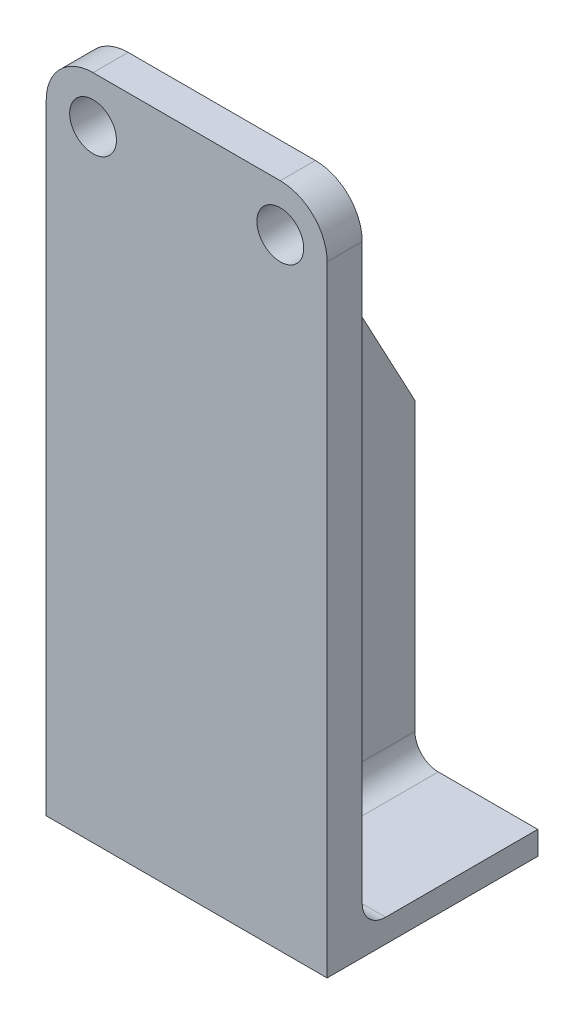
ISO-10303-21;
HEADER;
FILE_DESCRIPTION(('STEP AP214'),'2;1');
FILE_NAME('part.step','',(''),(''),'','','');
FILE_SCHEMA(('AUTOMOTIVE_DESIGN { 1 0 10303 214 1 1 1 1 }'));
ENDSEC;
DATA;
#1=APPLICATION_CONTEXT('core data for automotive mechanical design processes');
#2=APPLICATION_PROTOCOL_DEFINITION('international standard','automotive_design',2000,#1);
#3=PRODUCT_CONTEXT('',#1,'mechanical');
#4=PRODUCT('Part','Part','',(#3));
#5=PRODUCT_RELATED_PRODUCT_CATEGORY('part','',(#4));
#6=PRODUCT_DEFINITION_FORMATION('','',#4);
#7=PRODUCT_DEFINITION_CONTEXT('part definition',#1,'design');
#8=PRODUCT_DEFINITION('design','',#6,#7);
#9=PRODUCT_DEFINITION_SHAPE('','',#8);
#10=(LENGTH_UNIT() NAMED_UNIT(*) SI_UNIT(.MILLI.,.METRE.));
#11=(NAMED_UNIT(*) PLANE_ANGLE_UNIT() SI_UNIT($,.RADIAN.));
#12=(NAMED_UNIT(*) SI_UNIT($,.STERADIAN.) SOLID_ANGLE_UNIT());
#13=UNCERTAINTY_MEASURE_WITH_UNIT(LENGTH_MEASURE(1.E-05),#10,'distance_accuracy_value','');
#14=(GEOMETRIC_REPRESENTATION_CONTEXT(3) GLOBAL_UNCERTAINTY_ASSIGNED_CONTEXT((#13)) GLOBAL_UNIT_ASSIGNED_CONTEXT((#10,
#11,#12)) REPRESENTATION_CONTEXT('',''));
#15=CARTESIAN_POINT('',(0.,0.,0.));
#16=DIRECTION('',(0.,0.,1.));
#17=DIRECTION('',(1.,0.,0.));
#18=AXIS2_PLACEMENT_3D('',#15,#16,#17);
#19=CARTESIAN_POINT('',(-8.00000000000001,26.,0.));
#20=DIRECTION('',(0.,0.,-1.));
#21=DIRECTION('',(-1.,0.,0.));
#22=AXIS2_PLACEMENT_3D('',#19,#20,#21);
#23=PLANE('',#22);
#24=CARTESIAN_POINT('',(8.00000000000001,26.,0.));
#25=DIRECTION('',(0.,0.,1.));
#26=DIRECTION('',(1.,0.,0.));
#27=AXIS2_PLACEMENT_3D('',#24,#25,#26);
#28=CIRCLE('',#27,2.);
#29=CARTESIAN_POINT('',(10.,26.,0.));
#30=VERTEX_POINT('',#29);
#31=EDGE_CURVE('E213',#30,#30,#28,.T.);
#32=ORIENTED_EDGE('',*,*,#31,.T.);
#33=EDGE_LOOP('',(#32));
#34=FACE_BOUND('',#33,.T.);
#35=CARTESIAN_POINT('',(-8.00000000000001,26.,0.));
#36=DIRECTION('',(0.,0.,1.));
#37=DIRECTION('',(-1.,0.,0.));
#38=AXIS2_PLACEMENT_3D('',#35,#36,#37);
#39=CIRCLE('',#38,2.);
#40=CARTESIAN_POINT('',(-10.,26.,0.));
#41=VERTEX_POINT('',#40);
#42=EDGE_CURVE('E208',#41,#41,#39,.T.);
#43=ORIENTED_EDGE('',*,*,#42,.T.);
#44=EDGE_LOOP('',(#43));
#45=FACE_BOUND('',#44,.T.);
#46=DIRECTION('',(0.,1.,0.));
#47=VECTOR('',#46,1.);
#48=CARTESIAN_POINT('',(12.,26.,0.));
#49=LINE('',#48,#47);
#50=CARTESIAN_POINT('',(12.,-23.,0.));
#51=VERTEX_POINT('',#50);
#52=CARTESIAN_POINT('',(12.,26.,0.));
#53=VERTEX_POINT('',#52);
#54=EDGE_CURVE('E249',#51,#53,#49,.T.);
#55=ORIENTED_EDGE('',*,*,#54,.F.);
#56=DIRECTION('',(1.,0.,0.));
#57=VECTOR('',#56,1.);
#58=CARTESIAN_POINT('',(-8.00000000000001,-23.,0.));
#59=LINE('',#58,#57);
#60=CARTESIAN_POINT('',(1.5,-23.,0.));
#61=VERTEX_POINT('',#60);
#62=EDGE_CURVE('E291',#51,#61,#59,.F.);
#63=ORIENTED_EDGE('',*,*,#62,.T.);
#64=DIRECTION('',(0.,-1.,0.));
#65=VECTOR('',#64,1.);
#66=CARTESIAN_POINT('',(1.5,1.5,0.));
#67=LINE('',#66,#65);
#68=CARTESIAN_POINT('',(1.5,29.5,0.));
#69=VERTEX_POINT('',#68);
#70=EDGE_CURVE('E194',#69,#61,#67,.T.);
#71=ORIENTED_EDGE('',*,*,#70,.F.);
#72=DIRECTION('',(-1.,0.,0.));
#73=VECTOR('',#72,1.);
#74=CARTESIAN_POINT('',(1.5,29.5,0.));
#75=LINE('',#74,#73);
#76=CARTESIAN_POINT('',(-1.5,29.5,0.));
#77=VERTEX_POINT('',#76);
#78=EDGE_CURVE('E197',#69,#77,#75,.T.);
#79=ORIENTED_EDGE('',*,*,#78,.T.);
#80=DIRECTION('',(0.,-1.,0.));
#81=VECTOR('',#80,1.);
#82=CARTESIAN_POINT('',(-1.5,1.5,0.));
#83=LINE('',#82,#81);
#84=CARTESIAN_POINT('',(-1.5,-23.,0.));
#85=VERTEX_POINT('',#84);
#86=EDGE_CURVE('E185',#77,#85,#83,.T.);
#87=ORIENTED_EDGE('',*,*,#86,.T.);
#88=DIRECTION('',(1.,0.,0.));
#89=VECTOR('',#88,1.);
#90=CARTESIAN_POINT('',(-8.00000000000001,-23.,0.));
#91=LINE('',#90,#89);
#92=CARTESIAN_POINT('',(-12.,-23.,0.));
#93=VERTEX_POINT('',#92);
#94=EDGE_CURVE('E288',#85,#93,#91,.F.);
#95=ORIENTED_EDGE('',*,*,#94,.T.);
#96=DIRECTION('',(0.,-1.,0.));
#97=VECTOR('',#96,1.);
#98=CARTESIAN_POINT('',(-12.,26.,0.));
#99=LINE('',#98,#97);
#100=CARTESIAN_POINT('',(-12.,26.,0.));
#101=VERTEX_POINT('',#100);
#102=EDGE_CURVE('E245',#101,#93,#99,.T.);
#103=ORIENTED_EDGE('',*,*,#102,.F.);
#104=CARTESIAN_POINT('',(-8.00000000000001,26.,0.));
#105=DIRECTION('',(0.,0.,1.));
#106=DIRECTION('',(-1.,0.,0.));
#107=AXIS2_PLACEMENT_3D('',#104,#105,#106);
#108=CIRCLE('',#107,4.);
#109=CARTESIAN_POINT('',(-8.00000000000001,30.,0.));
#110=VERTEX_POINT('',#109);
#111=EDGE_CURVE('E221',#110,#101,#108,.T.);
#112=ORIENTED_EDGE('',*,*,#111,.F.);
#113=DIRECTION('',(-1.,0.,0.));
#114=VECTOR('',#113,1.);
#115=CARTESIAN_POINT('',(-8.00000000000001,30.,0.));
#116=LINE('',#115,#114);
#117=CARTESIAN_POINT('',(8.00000000000001,30.,0.));
#118=VERTEX_POINT('',#117);
#119=EDGE_CURVE('E230',#118,#110,#116,.T.);
#120=ORIENTED_EDGE('',*,*,#119,.F.);
#121=CARTESIAN_POINT('',(8.00000000000001,26.,0.));
#122=DIRECTION('',(0.,0.,1.));
#123=DIRECTION('',(1.,0.,0.));
#124=AXIS2_PLACEMENT_3D('',#121,#122,#123);
#125=CIRCLE('',#124,4.);
#126=EDGE_CURVE('E252',#53,#118,#125,.T.);
#127=ORIENTED_EDGE('',*,*,#126,.F.);
#128=EDGE_LOOP('',(#55,#63,#71,#79,#87,#95,#103,#112,#120,#127));
#129=FACE_BOUND('',#128,.T.);
#130=ADVANCED_FACE('F39',(#34,#45,#129),#23,.T.);
#131=CARTESIAN_POINT('',(-8.00000000000001,26.,3.));
#132=DIRECTION('',(0.,0.,-1.));
#133=DIRECTION('',(-1.,0.,0.));
#134=AXIS2_PLACEMENT_3D('',#131,#132,#133);
#135=PLANE('',#134);
#136=CARTESIAN_POINT('',(-8.00000000000001,26.,3.));
#137=DIRECTION('',(0.,0.,1.));
#138=DIRECTION('',(-1.,0.,0.));
#139=AXIS2_PLACEMENT_3D('',#136,#137,#138);
#140=CIRCLE('',#139,4.);
#141=CARTESIAN_POINT('',(-8.00000000000001,30.,3.));
#142=VERTEX_POINT('',#141);
#143=CARTESIAN_POINT('',(-12.,26.,3.));
#144=VERTEX_POINT('',#143);
#145=EDGE_CURVE('E225',#142,#144,#140,.T.);
#146=ORIENTED_EDGE('',*,*,#145,.T.);
#147=DIRECTION('',(0.,-1.,0.));
#148=VECTOR('',#147,1.);
#149=CARTESIAN_POINT('',(-12.,26.,3.));
#150=LINE('',#149,#148);
#151=CARTESIAN_POINT('',(-12.,-27.,3.));
#152=VERTEX_POINT('',#151);
#153=EDGE_CURVE('E229',#144,#152,#150,.T.);
#154=ORIENTED_EDGE('',*,*,#153,.T.);
#155=DIRECTION('',(-1.,0.,0.));
#156=VECTOR('',#155,1.);
#157=CARTESIAN_POINT('',(0.,-27.,3.));
#158=LINE('',#157,#156);
#159=CARTESIAN_POINT('',(12.,-27.,3.));
#160=VERTEX_POINT('',#159);
#161=EDGE_CURVE('E161',#160,#152,#158,.T.);
#162=ORIENTED_EDGE('',*,*,#161,.F.);
#163=DIRECTION('',(0.,1.,0.));
#164=VECTOR('',#163,1.);
#165=CARTESIAN_POINT('',(12.,26.,3.));
#166=LINE('',#165,#164);
#167=CARTESIAN_POINT('',(12.,26.,3.));
#168=VERTEX_POINT('',#167);
#169=EDGE_CURVE('E156',#160,#168,#166,.T.);
#170=ORIENTED_EDGE('',*,*,#169,.T.);
#171=CARTESIAN_POINT('',(8.00000000000001,26.,3.));
#172=DIRECTION('',(0.,0.,1.));
#173=DIRECTION('',(1.,0.,0.));
#174=AXIS2_PLACEMENT_3D('',#171,#172,#173);
#175=CIRCLE('',#174,4.);
#176=CARTESIAN_POINT('',(8.00000000000001,30.,3.));
#177=VERTEX_POINT('',#176);
#178=EDGE_CURVE('E235',#168,#177,#175,.T.);
#179=ORIENTED_EDGE('',*,*,#178,.T.);
#180=DIRECTION('',(-1.,0.,0.));
#181=VECTOR('',#180,1.);
#182=CARTESIAN_POINT('',(-8.00000000000001,30.,3.));
#183=LINE('',#182,#181);
#184=EDGE_CURVE('E238',#177,#142,#183,.T.);
#185=ORIENTED_EDGE('',*,*,#184,.T.);
#186=EDGE_LOOP('',(#146,#154,#162,#170,#179,#185));
#187=FACE_BOUND('',#186,.T.);
#188=CARTESIAN_POINT('',(8.00000000000001,26.,3.));
#189=DIRECTION('',(0.,0.,1.));
#190=DIRECTION('',(1.,0.,0.));
#191=AXIS2_PLACEMENT_3D('',#188,#189,#190);
#192=CIRCLE('',#191,2.);
#193=CARTESIAN_POINT('',(10.,26.,3.));
#194=VERTEX_POINT('',#193);
#195=EDGE_CURVE('E217',#194,#194,#192,.T.);
#196=ORIENTED_EDGE('',*,*,#195,.F.);
#197=EDGE_LOOP('',(#196));
#198=FACE_BOUND('',#197,.T.);
#199=CARTESIAN_POINT('',(-8.00000000000001,26.,3.));
#200=DIRECTION('',(0.,0.,1.));
#201=DIRECTION('',(-1.,0.,0.));
#202=AXIS2_PLACEMENT_3D('',#199,#200,#201);
#203=CIRCLE('',#202,2.);
#204=CARTESIAN_POINT('',(-10.,26.,3.));
#205=VERTEX_POINT('',#204);
#206=EDGE_CURVE('E209',#205,#205,#203,.T.);
#207=ORIENTED_EDGE('',*,*,#206,.F.);
#208=EDGE_LOOP('',(#207));
#209=FACE_BOUND('',#208,.T.);
#210=ADVANCED_FACE('F377',(#187,#198,#209),#135,.F.);
#211=CARTESIAN_POINT('',(-8.00000000000001,26.,3.));
#212=DIRECTION('',(0.,0.,-1.));
#213=DIRECTION('',(-1.,0.,0.));
#214=AXIS2_PLACEMENT_3D('',#211,#212,#213);
#215=CYLINDRICAL_SURFACE('',#214,4.);
#216=ORIENTED_EDGE('',*,*,#111,.T.);
#217=DIRECTION('',(0.,0.,-1.));
#218=VECTOR('',#217,1.);
#219=CARTESIAN_POINT('',(-12.,26.,3.));
#220=LINE('',#219,#218);
#221=EDGE_CURVE('E268',#144,#101,#220,.T.);
#222=ORIENTED_EDGE('',*,*,#221,.F.);
#223=ORIENTED_EDGE('',*,*,#145,.F.);
#224=DIRECTION('',(0.,0.,-1.));
#225=VECTOR('',#224,1.);
#226=CARTESIAN_POINT('',(-8.00000000000001,30.,3.));
#227=LINE('',#226,#225);
#228=EDGE_CURVE('E241',#142,#110,#227,.T.);
#229=ORIENTED_EDGE('',*,*,#228,.T.);
#230=EDGE_LOOP('',(#216,#222,#223,#229));
#231=FACE_BOUND('',#230,.T.);
#232=ADVANCED_FACE('F337',(#231),#215,.T.);
#233=CARTESIAN_POINT('',(-12.,26.,3.));
#234=DIRECTION('',(1.,0.,0.));
#235=DIRECTION('',(0.,1.,0.));
#236=AXIS2_PLACEMENT_3D('',#233,#234,#235);
#237=PLANE('',#236);
#238=ORIENTED_EDGE('',*,*,#102,.T.);
#239=CARTESIAN_POINT('',(-12.,-23.,-2.));
#240=DIRECTION('',(1.,0.,0.));
#241=DIRECTION('',(0.,1.,0.));
#242=AXIS2_PLACEMENT_3D('',#239,#240,#241);
#243=CIRCLE('',#242,2.);
#244=CARTESIAN_POINT('',(-12.,-25.,-2.));
#245=VERTEX_POINT('',#244);
#246=EDGE_CURVE('E11',#93,#245,#243,.T.);
#247=ORIENTED_EDGE('',*,*,#246,.T.);
#248=DIRECTION('',(0.,0.,-1.));
#249=VECTOR('',#248,1.);
#250=CARTESIAN_POINT('',(-12.,-25.,0.));
#251=LINE('',#250,#249);
#252=CARTESIAN_POINT('',(-12.,-25.,-15.));
#253=VERTEX_POINT('',#252);
#254=EDGE_CURVE('E171',#245,#253,#251,.T.);
#255=ORIENTED_EDGE('',*,*,#254,.T.);
#256=DIRECTION('',(0.,1.,0.));
#257=VECTOR('',#256,1.);
#258=CARTESIAN_POINT('',(-12.,-27.,-15.));
#259=LINE('',#258,#257);
#260=CARTESIAN_POINT('',(-12.,-27.,-15.));
#261=VERTEX_POINT('',#260);
#262=EDGE_CURVE('E180',#261,#253,#259,.T.);
#263=ORIENTED_EDGE('',*,*,#262,.F.);
#264=DIRECTION('',(0.,0.,-1.));
#265=VECTOR('',#264,1.);
#266=CARTESIAN_POINT('',(-12.,-27.,0.));
#267=LINE('',#266,#265);
#268=EDGE_CURVE('E167',#152,#261,#267,.T.);
#269=ORIENTED_EDGE('',*,*,#268,.F.);
#270=ORIENTED_EDGE('',*,*,#153,.F.);
#271=ORIENTED_EDGE('',*,*,#221,.T.);
#272=EDGE_LOOP('',(#238,#247,#255,#263,#269,#270,#271));
#273=FACE_BOUND('',#272,.T.);
#274=ADVANCED_FACE('F333',(#273),#237,.F.);
#275=CARTESIAN_POINT('',(12.,26.,3.));
#276=DIRECTION('',(-1.,0.,0.));
#277=DIRECTION('',(0.,-1.,0.));
#278=AXIS2_PLACEMENT_3D('',#275,#276,#277);
#279=PLANE('',#278);
#280=ORIENTED_EDGE('',*,*,#169,.F.);
#281=DIRECTION('',(0.,0.,1.));
#282=VECTOR('',#281,1.);
#283=CARTESIAN_POINT('',(12.,-27.,0.));
#284=LINE('',#283,#282);
#285=CARTESIAN_POINT('',(12.,-27.,-15.));
#286=VERTEX_POINT('',#285);
#287=EDGE_CURVE('E149',#286,#160,#284,.T.);
#288=ORIENTED_EDGE('',*,*,#287,.F.);
#289=DIRECTION('',(0.,1.,0.));
#290=VECTOR('',#289,1.);
#291=CARTESIAN_POINT('',(12.,-27.,-15.));
#292=LINE('',#291,#290);
#293=CARTESIAN_POINT('',(12.,-25.,-15.));
#294=VERTEX_POINT('',#293);
#295=EDGE_CURVE('E154',#286,#294,#292,.T.);
#296=ORIENTED_EDGE('',*,*,#295,.T.);
#297=DIRECTION('',(0.,0.,1.));
#298=VECTOR('',#297,1.);
#299=CARTESIAN_POINT('',(12.,-25.,0.));
#300=LINE('',#299,#298);
#301=CARTESIAN_POINT('',(12.,-25.,-2.));
#302=VERTEX_POINT('',#301);
#303=EDGE_CURVE('E642',#294,#302,#300,.T.);
#304=ORIENTED_EDGE('',*,*,#303,.T.);
#305=CARTESIAN_POINT('',(12.,-23.,-2.));
#306=DIRECTION('',(-1.,0.,0.));
#307=DIRECTION('',(0.,-1.,0.));
#308=AXIS2_PLACEMENT_3D('',#305,#306,#307);
#309=CIRCLE('',#308,2.);
#310=EDGE_CURVE('E305',#302,#51,#309,.T.);
#311=ORIENTED_EDGE('',*,*,#310,.T.);
#312=ORIENTED_EDGE('',*,*,#54,.T.);
#313=DIRECTION('',(0.,0.,-1.));
#314=VECTOR('',#313,1.);
#315=CARTESIAN_POINT('',(12.,26.,3.));
#316=LINE('',#315,#314);
#317=EDGE_CURVE('E264',#168,#53,#316,.T.);
#318=ORIENTED_EDGE('',*,*,#317,.F.);
#319=EDGE_LOOP('',(#280,#288,#296,#304,#311,#312,#318));
#320=FACE_BOUND('',#319,.T.);
#321=ADVANCED_FACE('F151',(#320),#279,.F.);
#322=CARTESIAN_POINT('',(8.00000000000001,26.,3.));
#323=DIRECTION('',(0.,0.,-1.));
#324=DIRECTION('',(-1.,0.,0.));
#325=AXIS2_PLACEMENT_3D('',#322,#323,#324);
#326=CYLINDRICAL_SURFACE('',#325,4.);
#327=ORIENTED_EDGE('',*,*,#126,.T.);
#328=DIRECTION('',(0.,0.,-1.));
#329=VECTOR('',#328,1.);
#330=CARTESIAN_POINT('',(8.00000000000001,30.,3.));
#331=LINE('',#330,#329);
#332=EDGE_CURVE('E260',#177,#118,#331,.T.);
#333=ORIENTED_EDGE('',*,*,#332,.F.);
#334=ORIENTED_EDGE('',*,*,#178,.F.);
#335=ORIENTED_EDGE('',*,*,#317,.T.);
#336=EDGE_LOOP('',(#327,#333,#334,#335));
#337=FACE_BOUND('',#336,.T.);
#338=ADVANCED_FACE('F347',(#337),#326,.T.);
#339=CARTESIAN_POINT('',(-8.00000000000001,30.,3.));
#340=DIRECTION('',(0.,-1.,0.));
#341=DIRECTION('',(0.,0.,-1.));
#342=AXIS2_PLACEMENT_3D('',#339,#340,#341);
#343=PLANE('',#342);
#344=ORIENTED_EDGE('',*,*,#119,.T.);
#345=ORIENTED_EDGE('',*,*,#228,.F.);
#346=ORIENTED_EDGE('',*,*,#184,.F.);
#347=ORIENTED_EDGE('',*,*,#332,.T.);
#348=EDGE_LOOP('',(#344,#345,#346,#347));
#349=FACE_BOUND('',#348,.T.);
#350=ADVANCED_FACE('F342',(#349),#343,.F.);
#351=CARTESIAN_POINT('',(8.00000000000001,26.,3.));
#352=DIRECTION('',(0.,0.,-1.));
#353=DIRECTION('',(-1.,0.,0.));
#354=AXIS2_PLACEMENT_3D('',#351,#352,#353);
#355=CYLINDRICAL_SURFACE('',#354,2.);
#356=ORIENTED_EDGE('',*,*,#195,.T.);
#357=EDGE_LOOP('',(#356));
#358=FACE_BOUND('',#357,.T.);
#359=ORIENTED_EDGE('',*,*,#31,.F.);
#360=EDGE_LOOP('',(#359));
#361=FACE_BOUND('',#360,.T.);
#362=ADVANCED_FACE('F390',(#358,#361),#355,.F.);
#363=CARTESIAN_POINT('',(-8.00000000000001,26.,3.));
#364=DIRECTION('',(0.,0.,-1.));
#365=DIRECTION('',(-1.,0.,0.));
#366=AXIS2_PLACEMENT_3D('',#363,#364,#365);
#367=CYLINDRICAL_SURFACE('',#366,2.);
#368=ORIENTED_EDGE('',*,*,#206,.T.);
#369=EDGE_LOOP('',(#368));
#370=FACE_BOUND('',#369,.T.);
#371=ORIENTED_EDGE('',*,*,#42,.F.);
#372=EDGE_LOOP('',(#371));
#373=FACE_BOUND('',#372,.T.);
#374=ADVANCED_FACE('F458',(#370,#373),#367,.F.);
#375=CARTESIAN_POINT('',(27.0748134316813,0.,-15.));
#376=DIRECTION('',(0.,0.,1.));
#377=DIRECTION('',(1.,0.,0.));
#378=AXIS2_PLACEMENT_3D('',#375,#376,#377);
#379=PLANE('',#378);
#380=DIRECTION('',(0.,-1.,0.));
#381=VECTOR('',#380,1.);
#382=CARTESIAN_POINT('',(1.5,0.,-15.));
#383=LINE('',#382,#381);
#384=CARTESIAN_POINT('',(1.5,1.5,-15.));
#385=VERTEX_POINT('',#384);
#386=CARTESIAN_POINT('',(1.5,-23.,-15.));
#387=VERTEX_POINT('',#386);
#388=EDGE_CURVE('E272',#385,#387,#383,.T.);
#389=ORIENTED_EDGE('',*,*,#388,.T.);
#390=CARTESIAN_POINT('',(3.5,-23.,-15.));
#391=DIRECTION('',(0.,0.,1.));
#392=DIRECTION('',(1.,0.,0.));
#393=AXIS2_PLACEMENT_3D('',#390,#391,#392);
#394=CIRCLE('',#393,2.);
#395=CARTESIAN_POINT('',(3.5,-25.,-15.));
#396=VERTEX_POINT('',#395);
#397=EDGE_CURVE('E302',#387,#396,#394,.T.);
#398=ORIENTED_EDGE('',*,*,#397,.T.);
#399=DIRECTION('',(1.,0.,0.));
#400=VECTOR('',#399,1.);
#401=CARTESIAN_POINT('',(0.,-25.,-15.));
#402=LINE('',#401,#400);
#403=EDGE_CURVE('E176',#396,#294,#402,.T.);
#404=ORIENTED_EDGE('',*,*,#403,.T.);
#405=ORIENTED_EDGE('',*,*,#295,.F.);
#406=DIRECTION('',(1.,0.,0.));
#407=VECTOR('',#406,1.);
#408=CARTESIAN_POINT('',(0.,-27.,-15.));
#409=LINE('',#408,#407);
#410=EDGE_CURVE('E162',#261,#286,#409,.T.);
#411=ORIENTED_EDGE('',*,*,#410,.F.);
#412=ORIENTED_EDGE('',*,*,#262,.T.);
#413=CARTESIAN_POINT('',(-3.5,-25.,-15.));
#414=VERTEX_POINT('',#413);
#415=EDGE_CURVE('E318',#253,#414,#402,.T.);
#416=ORIENTED_EDGE('',*,*,#415,.T.);
#417=CARTESIAN_POINT('',(-3.5,-23.,-15.));
#418=DIRECTION('',(0.,0.,1.));
#419=DIRECTION('',(1.,0.,0.));
#420=AXIS2_PLACEMENT_3D('',#417,#418,#419);
#421=CIRCLE('',#420,2.);
#422=CARTESIAN_POINT('',(-1.5,-23.,-15.));
#423=VERTEX_POINT('',#422);
#424=EDGE_CURVE('E49',#414,#423,#421,.T.);
#425=ORIENTED_EDGE('',*,*,#424,.T.);
#426=DIRECTION('',(0.,1.,0.));
#427=VECTOR('',#426,1.);
#428=CARTESIAN_POINT('',(-1.5,0.,-15.));
#429=LINE('',#428,#427);
#430=CARTESIAN_POINT('',(-1.5,1.5,-15.));
#431=VERTEX_POINT('',#430);
#432=EDGE_CURVE('E275',#423,#431,#429,.T.);
#433=ORIENTED_EDGE('',*,*,#432,.T.);
#434=DIRECTION('',(-1.,0.,0.));
#435=VECTOR('',#434,1.);
#436=CARTESIAN_POINT('',(1.5,1.5,-15.));
#437=LINE('',#436,#435);
#438=EDGE_CURVE('E204',#385,#431,#437,.T.);
#439=ORIENTED_EDGE('',*,*,#438,.F.);
#440=EDGE_LOOP('',(#389,#398,#404,#405,#411,#412,#416,#425,#433,#439));
#441=FACE_BOUND('',#440,.T.);
#442=ADVANCED_FACE('F174',(#441),#379,.F.);
#443=CARTESIAN_POINT('',(1.5,29.5,0.));
#444=DIRECTION('',(0.,-0.472221412515419,0.881479970028782));
#445=DIRECTION('',(0.,-0.881479970028782,-0.472221412515419));
#446=AXIS2_PLACEMENT_3D('',#443,#444,#445);
#447=PLANE('',#446);
#448=DIRECTION('',(0.,0.881479970028782,0.472221412515419));
#449=VECTOR('',#448,1.);
#450=CARTESIAN_POINT('',(-1.5,29.5,0.));
#451=LINE('',#450,#449);
#452=EDGE_CURVE('E179',#431,#77,#451,.T.);
#453=ORIENTED_EDGE('',*,*,#452,.T.);
#454=ORIENTED_EDGE('',*,*,#78,.F.);
#455=DIRECTION('',(0.,0.881479970028782,0.472221412515419));
#456=VECTOR('',#455,1.);
#457=CARTESIAN_POINT('',(1.5,29.5,0.));
#458=LINE('',#457,#456);
#459=EDGE_CURVE('E190',#385,#69,#458,.T.);
#460=ORIENTED_EDGE('',*,*,#459,.F.);
#461=ORIENTED_EDGE('',*,*,#438,.T.);
#462=EDGE_LOOP('',(#453,#454,#460,#461));
#463=FACE_BOUND('',#462,.T.);
#464=ADVANCED_FACE('F363',(#463),#447,.F.);
#465=CARTESIAN_POINT('',(1.5,0.,0.));
#466=DIRECTION('',(-1.,0.,0.));
#467=DIRECTION('',(0.,0.,1.));
#468=AXIS2_PLACEMENT_3D('',#465,#466,#467);
#469=PLANE('',#468);
#470=ORIENTED_EDGE('',*,*,#70,.T.);
#471=DIRECTION('',(0.,0.,1.));
#472=VECTOR('',#471,1.);
#473=CARTESIAN_POINT('',(1.5,-23.,-15.));
#474=LINE('',#473,#472);
#475=EDGE_CURVE('E285',#61,#387,#474,.F.);
#476=ORIENTED_EDGE('',*,*,#475,.T.);
#477=ORIENTED_EDGE('',*,*,#388,.F.);
#478=ORIENTED_EDGE('',*,*,#459,.T.);
#479=EDGE_LOOP('',(#470,#476,#477,#478));
#480=FACE_BOUND('',#479,.T.);
#481=ADVANCED_FACE('F359',(#480),#469,.F.);
#482=CARTESIAN_POINT('',(-1.5,0.,0.));
#483=DIRECTION('',(-1.,0.,0.));
#484=DIRECTION('',(0.,0.,1.));
#485=AXIS2_PLACEMENT_3D('',#482,#483,#484);
#486=PLANE('',#485);
#487=ORIENTED_EDGE('',*,*,#432,.F.);
#488=DIRECTION('',(0.,0.,-1.));
#489=VECTOR('',#488,1.);
#490=CARTESIAN_POINT('',(-1.5,-23.,0.));
#491=LINE('',#490,#489);
#492=EDGE_CURVE('E299',#423,#85,#491,.F.);
#493=ORIENTED_EDGE('',*,*,#492,.T.);
#494=ORIENTED_EDGE('',*,*,#86,.F.);
#495=ORIENTED_EDGE('',*,*,#452,.F.);
#496=EDGE_LOOP('',(#487,#493,#494,#495));
#497=FACE_BOUND('',#496,.T.);
#498=ADVANCED_FACE('F365',(#497),#486,.T.);
#499=CARTESIAN_POINT('',(0.,-25.,0.));
#500=DIRECTION('',(0.,-1.,0.));
#501=DIRECTION('',(0.,0.,-1.));
#502=AXIS2_PLACEMENT_3D('',#499,#500,#501);
#503=PLANE('',#502);
#504=DIRECTION('',(1.,0.,0.));
#505=VECTOR('',#504,1.);
#506=CARTESIAN_POINT('',(0.,-25.,-2.));
#507=LINE('',#506,#505);
#508=CARTESIAN_POINT('',(-3.5,-25.,-2.));
#509=VERTEX_POINT('',#508);
#510=EDGE_CURVE('E64',#245,#509,#507,.T.);
#511=ORIENTED_EDGE('',*,*,#510,.T.);
#512=DIRECTION('',(0.,0.,-1.));
#513=VECTOR('',#512,1.);
#514=CARTESIAN_POINT('',(-3.5,-25.,0.));
#515=LINE('',#514,#513);
#516=EDGE_CURVE('E296',#509,#414,#515,.T.);
#517=ORIENTED_EDGE('',*,*,#516,.T.);
#518=ORIENTED_EDGE('',*,*,#415,.F.);
#519=ORIENTED_EDGE('',*,*,#254,.F.);
#520=EDGE_LOOP('',(#511,#517,#518,#519));
#521=FACE_BOUND('',#520,.T.);
#522=ADVANCED_FACE('F367',(#521),#503,.F.);
#523=ORIENTED_EDGE('',*,*,#403,.F.);
#524=DIRECTION('',(0.,0.,1.));
#525=VECTOR('',#524,1.);
#526=CARTESIAN_POINT('',(3.5,-25.,0.));
#527=LINE('',#526,#525);
#528=CARTESIAN_POINT('',(3.5,-25.,-2.));
#529=VERTEX_POINT('',#528);
#530=EDGE_CURVE('E281',#396,#529,#527,.T.);
#531=ORIENTED_EDGE('',*,*,#530,.T.);
#532=DIRECTION('',(1.,0.,0.));
#533=VECTOR('',#532,1.);
#534=CARTESIAN_POINT('',(0.,-25.,-2.));
#535=LINE('',#534,#533);
#536=EDGE_CURVE('E278',#529,#302,#535,.T.);
#537=ORIENTED_EDGE('',*,*,#536,.T.);
#538=ORIENTED_EDGE('',*,*,#303,.F.);
#539=EDGE_LOOP('',(#523,#531,#537,#538));
#540=FACE_BOUND('',#539,.T.);
#541=ADVANCED_FACE('F353',(#540),#503,.F.);
#542=CARTESIAN_POINT('',(0.,-27.,0.));
#543=DIRECTION('',(0.,-1.,0.));
#544=DIRECTION('',(0.,0.,-1.));
#545=AXIS2_PLACEMENT_3D('',#542,#543,#544);
#546=PLANE('',#545);
#547=ORIENTED_EDGE('',*,*,#410,.T.);
#548=ORIENTED_EDGE('',*,*,#287,.T.);
#549=ORIENTED_EDGE('',*,*,#161,.T.);
#550=ORIENTED_EDGE('',*,*,#268,.T.);
#551=EDGE_LOOP('',(#547,#548,#549,#550));
#552=FACE_BOUND('',#551,.T.);
#553=ADVANCED_FACE('F165',(#552),#546,.T.);
#554=CARTESIAN_POINT('',(0.,-23.,-2.));
#555=DIRECTION('',(1.,0.,0.));
#556=DIRECTION('',(0.,0.,-1.));
#557=AXIS2_PLACEMENT_3D('',#554,#555,#556);
#558=CYLINDRICAL_SURFACE('',#557,2.);
#559=ORIENTED_EDGE('',*,*,#310,.F.);
#560=ORIENTED_EDGE('',*,*,#536,.F.);
#561=CARTESIAN_POINT('',(3.5,-23.,-2.));
#562=DIRECTION('',(-0.707106781186547,0.,-0.707106781186547));
#563=DIRECTION('',(0.707106781186547,0.,-0.707106781186547));
#564=AXIS2_PLACEMENT_3D('',#561,#562,#563);
#565=ELLIPSE('',#564,2.82842712474619,2.);
#566=EDGE_CURVE('E309',#61,#529,#565,.F.);
#567=ORIENTED_EDGE('',*,*,#566,.F.);
#568=ORIENTED_EDGE('',*,*,#62,.F.);
#569=EDGE_LOOP('',(#559,#560,#567,#568));
#570=FACE_BOUND('',#569,.T.);
#571=ADVANCED_FACE('F351',(#570),#558,.F.);
#572=CARTESIAN_POINT('',(3.5,-23.,0.));
#573=DIRECTION('',(0.,0.,-1.));
#574=DIRECTION('',(-1.,0.,0.));
#575=AXIS2_PLACEMENT_3D('',#572,#573,#574);
#576=CYLINDRICAL_SURFACE('',#575,2.);
#577=ORIENTED_EDGE('',*,*,#397,.F.);
#578=ORIENTED_EDGE('',*,*,#475,.F.);
#579=ORIENTED_EDGE('',*,*,#566,.T.);
#580=ORIENTED_EDGE('',*,*,#530,.F.);
#581=EDGE_LOOP('',(#577,#578,#579,#580));
#582=FACE_BOUND('',#581,.T.);
#583=ADVANCED_FACE('F355',(#582),#576,.F.);
#584=CARTESIAN_POINT('',(0.,-23.,-2.));
#585=DIRECTION('',(1.,0.,0.));
#586=DIRECTION('',(0.,0.,-1.));
#587=AXIS2_PLACEMENT_3D('',#584,#585,#586);
#588=CYLINDRICAL_SURFACE('',#587,2.);
#589=ORIENTED_EDGE('',*,*,#246,.F.);
#590=ORIENTED_EDGE('',*,*,#94,.F.);
#591=CARTESIAN_POINT('',(-3.5,-23.,-2.));
#592=DIRECTION('',(0.707106781186547,0.,-0.707106781186547));
#593=DIRECTION('',(-0.707106781186547,0.,-0.707106781186547));
#594=AXIS2_PLACEMENT_3D('',#591,#592,#593);
#595=ELLIPSE('',#594,2.82842712474619,2.);
#596=EDGE_CURVE('E43',#509,#85,#595,.F.);
#597=ORIENTED_EDGE('',*,*,#596,.F.);
#598=ORIENTED_EDGE('',*,*,#510,.F.);
#599=EDGE_LOOP('',(#589,#590,#597,#598));
#600=FACE_BOUND('',#599,.T.);
#601=ADVANCED_FACE('F41',(#600),#588,.F.);
#602=CARTESIAN_POINT('',(-3.5,-23.,0.));
#603=DIRECTION('',(0.,0.,-1.));
#604=DIRECTION('',(-1.,0.,0.));
#605=AXIS2_PLACEMENT_3D('',#602,#603,#604);
#606=CYLINDRICAL_SURFACE('',#605,2.);
#607=ORIENTED_EDGE('',*,*,#596,.T.);
#608=ORIENTED_EDGE('',*,*,#492,.F.);
#609=ORIENTED_EDGE('',*,*,#424,.F.);
#610=ORIENTED_EDGE('',*,*,#516,.F.);
#611=EDGE_LOOP('',(#607,#608,#609,#610));
#612=FACE_BOUND('',#611,.T.);
#613=ADVANCED_FACE('F324',(#612),#606,.F.);
#614=CLOSED_SHELL('',(#130,#210,#232,#274,#321,#338,#350,#362,#374,#442,#464,#481,#498,#522,
#541,#553,#571,#583,#601,#613));
#615=MANIFOLD_SOLID_BREP('B2',#614);
#616=ADVANCED_BREP_SHAPE_REPRESENTATION('',(#18,#615),#14);
#617=SHAPE_DEFINITION_REPRESENTATION(#9,#616);
ENDSEC;
END-ISO-10303-21;
